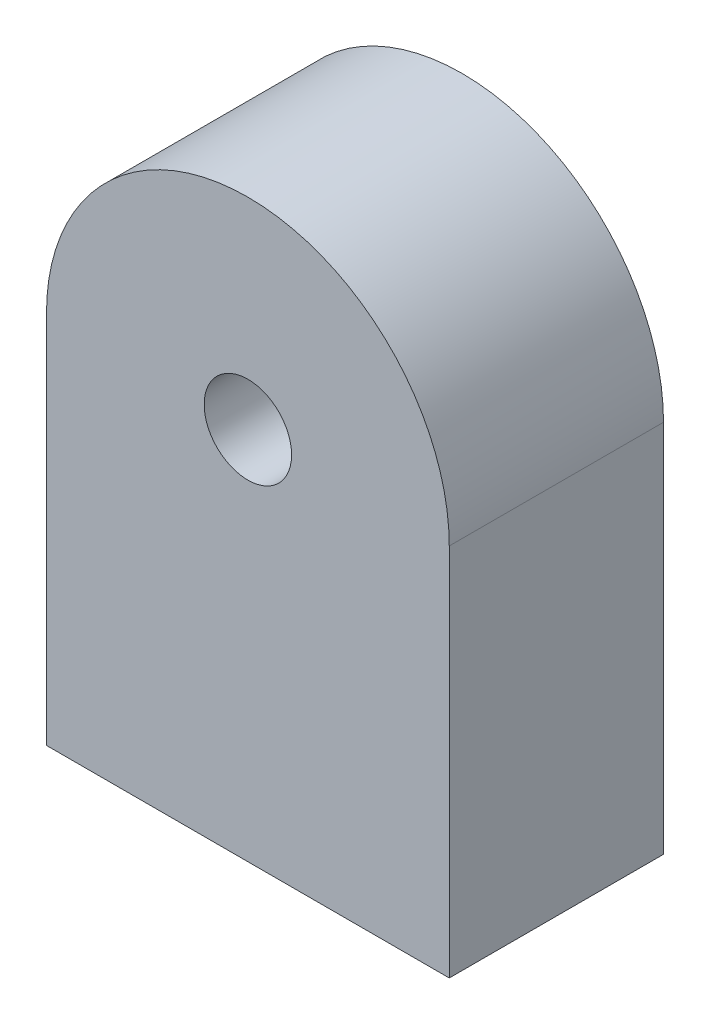
ISO-10303-21;
HEADER;
FILE_DESCRIPTION(('STEP AP214'),'2;1');
FILE_NAME('part.step','',(''),(''),'','','');
FILE_SCHEMA(('AUTOMOTIVE_DESIGN { 1 0 10303 214 1 1 1 1 }'));
ENDSEC;
DATA;
#1=APPLICATION_CONTEXT('core data for automotive mechanical design processes');
#2=APPLICATION_PROTOCOL_DEFINITION('international standard','automotive_design',2000,#1);
#3=PRODUCT_CONTEXT('',#1,'mechanical');
#4=PRODUCT('Part','Part','',(#3));
#5=PRODUCT_RELATED_PRODUCT_CATEGORY('part','',(#4));
#6=PRODUCT_DEFINITION_FORMATION('','',#4);
#7=PRODUCT_DEFINITION_CONTEXT('part definition',#1,'design');
#8=PRODUCT_DEFINITION('design','',#6,#7);
#9=PRODUCT_DEFINITION_SHAPE('','',#8);
#10=(LENGTH_UNIT() NAMED_UNIT(*) SI_UNIT(.MILLI.,.METRE.));
#11=(NAMED_UNIT(*) PLANE_ANGLE_UNIT() SI_UNIT($,.RADIAN.));
#12=(NAMED_UNIT(*) SI_UNIT($,.STERADIAN.) SOLID_ANGLE_UNIT());
#13=UNCERTAINTY_MEASURE_WITH_UNIT(LENGTH_MEASURE(1.E-05),#10,'distance_accuracy_value','');
#14=(GEOMETRIC_REPRESENTATION_CONTEXT(3) GLOBAL_UNCERTAINTY_ASSIGNED_CONTEXT((#13)) GLOBAL_UNIT_ASSIGNED_CONTEXT((#10,
#11,#12)) REPRESENTATION_CONTEXT('',''));
#15=CARTESIAN_POINT('',(0.,0.,0.));
#16=DIRECTION('',(0.,0.,1.));
#17=DIRECTION('',(1.,0.,0.));
#18=AXIS2_PLACEMENT_3D('',#15,#16,#17);
#19=CARTESIAN_POINT('',(-3.68368916814229,4.36615833894154,2.5));
#20=DIRECTION('',(0.,0.,-1.));
#21=DIRECTION('',(-1.,0.,0.));
#22=AXIS2_PLACEMENT_3D('',#19,#20,#21);
#23=PLANE('',#22);
#24=DIRECTION('',(1.,0.,0.));
#25=VECTOR('',#24,1.);
#26=CARTESIAN_POINT('',(-1.33368916814229,0.,2.5));
#27=LINE('',#26,#25);
#28=CARTESIAN_POINT('',(-6.03368916814229,0.,2.5));
#29=VERTEX_POINT('',#28);
#30=CARTESIAN_POINT('',(-1.33368916814229,0.,2.5));
#31=VERTEX_POINT('',#30);
#32=EDGE_CURVE('E83',#29,#31,#27,.T.);
#33=ORIENTED_EDGE('',*,*,#32,.T.);
#34=DIRECTION('',(0.,1.,0.));
#35=VECTOR('',#34,1.);
#36=CARTESIAN_POINT('',(-1.33368916814229,4.36615833894154,2.5));
#37=LINE('',#36,#35);
#38=CARTESIAN_POINT('',(-1.33368916814229,4.36615833894154,2.5));
#39=VERTEX_POINT('',#38);
#40=EDGE_CURVE('E78',#31,#39,#37,.T.);
#41=ORIENTED_EDGE('',*,*,#40,.T.);
#42=CARTESIAN_POINT('',(-3.68368916814229,4.36615833894154,2.5));
#43=DIRECTION('',(0.,0.,1.));
#44=DIRECTION('',(-1.,0.,0.));
#45=AXIS2_PLACEMENT_3D('',#42,#43,#44);
#46=CIRCLE('',#45,2.35);
#47=CARTESIAN_POINT('',(-6.03368916814229,4.36615833894154,2.5));
#48=VERTEX_POINT('',#47);
#49=EDGE_CURVE('E81',#39,#48,#46,.T.);
#50=ORIENTED_EDGE('',*,*,#49,.T.);
#51=DIRECTION('',(0.,-1.,0.));
#52=VECTOR('',#51,1.);
#53=CARTESIAN_POINT('',(-6.03368916814229,0.,2.5));
#54=LINE('',#53,#52);
#55=EDGE_CURVE('E48',#48,#29,#54,.T.);
#56=ORIENTED_EDGE('',*,*,#55,.T.);
#57=EDGE_LOOP('',(#33,#41,#50,#56));
#58=FACE_BOUND('',#57,.T.);
#59=CARTESIAN_POINT('',(-3.68368916814229,4.36615833894154,2.5));
#60=DIRECTION('',(0.,0.,1.));
#61=DIRECTION('',(1.,0.,0.));
#62=AXIS2_PLACEMENT_3D('',#59,#60,#61);
#63=CIRCLE('',#62,0.51);
#64=CARTESIAN_POINT('',(-3.17368916814229,4.36615833894154,2.5));
#65=VERTEX_POINT('',#64);
#66=EDGE_CURVE('E98',#65,#65,#63,.T.);
#67=ORIENTED_EDGE('',*,*,#66,.F.);
#68=EDGE_LOOP('',(#67));
#69=FACE_BOUND('',#68,.T.);
#70=ADVANCED_FACE('F31',(#58,#69),#23,.F.);
#71=CARTESIAN_POINT('',(-3.68368916814229,4.36615833894154,0.));
#72=DIRECTION('',(0.,0.,-1.));
#73=DIRECTION('',(-1.,0.,0.));
#74=AXIS2_PLACEMENT_3D('',#71,#72,#73);
#75=PLANE('',#74);
#76=DIRECTION('',(1.,0.,0.));
#77=VECTOR('',#76,1.);
#78=CARTESIAN_POINT('',(-1.33368916814229,0.,0.));
#79=LINE('',#78,#77);
#80=CARTESIAN_POINT('',(-6.03368916814229,0.,0.));
#81=VERTEX_POINT('',#80);
#82=CARTESIAN_POINT('',(-1.33368916814229,0.,0.));
#83=VERTEX_POINT('',#82);
#84=EDGE_CURVE('E95',#81,#83,#79,.T.);
#85=ORIENTED_EDGE('',*,*,#84,.F.);
#86=DIRECTION('',(0.,-1.,0.));
#87=VECTOR('',#86,1.);
#88=CARTESIAN_POINT('',(-6.03368916814229,0.,0.));
#89=LINE('',#88,#87);
#90=CARTESIAN_POINT('',(-6.03368916814229,4.36615833894154,0.));
#91=VERTEX_POINT('',#90);
#92=EDGE_CURVE('E71',#91,#81,#89,.T.);
#93=ORIENTED_EDGE('',*,*,#92,.F.);
#94=CARTESIAN_POINT('',(-3.68368916814229,4.36615833894154,0.));
#95=DIRECTION('',(0.,0.,1.));
#96=DIRECTION('',(-1.,0.,0.));
#97=AXIS2_PLACEMENT_3D('',#94,#95,#96);
#98=CIRCLE('',#97,2.35);
#99=CARTESIAN_POINT('',(-1.33368916814229,4.36615833894154,0.));
#100=VERTEX_POINT('',#99);
#101=EDGE_CURVE('E65',#100,#91,#98,.T.);
#102=ORIENTED_EDGE('',*,*,#101,.F.);
#103=DIRECTION('',(0.,1.,0.));
#104=VECTOR('',#103,1.);
#105=CARTESIAN_POINT('',(-1.33368916814229,4.36615833894154,0.));
#106=LINE('',#105,#104);
#107=EDGE_CURVE('E87',#83,#100,#106,.T.);
#108=ORIENTED_EDGE('',*,*,#107,.F.);
#109=EDGE_LOOP('',(#85,#93,#102,#108));
#110=FACE_BOUND('',#109,.T.);
#111=CARTESIAN_POINT('',(-3.68368916814229,4.36615833894154,0.));
#112=DIRECTION('',(0.,0.,1.));
#113=DIRECTION('',(1.,0.,0.));
#114=AXIS2_PLACEMENT_3D('',#111,#112,#113);
#115=CIRCLE('',#114,0.51);
#116=CARTESIAN_POINT('',(-3.17368916814229,4.36615833894154,0.));
#117=VERTEX_POINT('',#116);
#118=EDGE_CURVE('E110',#117,#117,#115,.T.);
#119=ORIENTED_EDGE('',*,*,#118,.T.);
#120=EDGE_LOOP('',(#119));
#121=FACE_BOUND('',#120,.T.);
#122=ADVANCED_FACE('F106',(#110,#121),#75,.T.);
#123=CARTESIAN_POINT('',(-1.33368916814229,0.,2.5));
#124=DIRECTION('',(0.,1.,0.));
#125=DIRECTION('',(-1.,0.,0.));
#126=AXIS2_PLACEMENT_3D('',#123,#124,#125);
#127=PLANE('',#126);
#128=ORIENTED_EDGE('',*,*,#84,.T.);
#129=DIRECTION('',(0.,0.,-1.));
#130=VECTOR('',#129,1.);
#131=CARTESIAN_POINT('',(-1.33368916814229,0.,2.5));
#132=LINE('',#131,#130);
#133=EDGE_CURVE('E11',#31,#83,#132,.T.);
#134=ORIENTED_EDGE('',*,*,#133,.F.);
#135=ORIENTED_EDGE('',*,*,#32,.F.);
#136=DIRECTION('',(0.,0.,-1.));
#137=VECTOR('',#136,1.);
#138=CARTESIAN_POINT('',(-6.03368916814229,0.,2.5));
#139=LINE('',#138,#137);
#140=EDGE_CURVE('E91',#29,#81,#139,.T.);
#141=ORIENTED_EDGE('',*,*,#140,.T.);
#142=EDGE_LOOP('',(#128,#134,#135,#141));
#143=FACE_BOUND('',#142,.T.);
#144=ADVANCED_FACE('F33',(#143),#127,.F.);
#145=CARTESIAN_POINT('',(-1.33368916814229,4.36615833894154,2.5));
#146=DIRECTION('',(-1.,0.,0.));
#147=DIRECTION('',(0.,-1.,0.));
#148=AXIS2_PLACEMENT_3D('',#145,#146,#147);
#149=PLANE('',#148);
#150=ORIENTED_EDGE('',*,*,#107,.T.);
#151=DIRECTION('',(0.,0.,-1.));
#152=VECTOR('',#151,1.);
#153=CARTESIAN_POINT('',(-1.33368916814229,4.36615833894154,2.5));
#154=LINE('',#153,#152);
#155=EDGE_CURVE('E40',#39,#100,#154,.T.);
#156=ORIENTED_EDGE('',*,*,#155,.F.);
#157=ORIENTED_EDGE('',*,*,#40,.F.);
#158=ORIENTED_EDGE('',*,*,#133,.T.);
#159=EDGE_LOOP('',(#150,#156,#157,#158));
#160=FACE_BOUND('',#159,.T.);
#161=ADVANCED_FACE('F86',(#160),#149,.F.);
#162=CARTESIAN_POINT('',(-3.68368916814229,4.36615833894154,2.5));
#163=DIRECTION('',(0.,0.,-1.));
#164=DIRECTION('',(-1.,0.,0.));
#165=AXIS2_PLACEMENT_3D('',#162,#163,#164);
#166=CYLINDRICAL_SURFACE('',#165,2.35);
#167=ORIENTED_EDGE('',*,*,#101,.T.);
#168=DIRECTION('',(0.,0.,-1.));
#169=VECTOR('',#168,1.);
#170=CARTESIAN_POINT('',(-6.03368916814229,4.36615833894154,2.5));
#171=LINE('',#170,#169);
#172=EDGE_CURVE('E88',#48,#91,#171,.T.);
#173=ORIENTED_EDGE('',*,*,#172,.F.);
#174=ORIENTED_EDGE('',*,*,#49,.F.);
#175=ORIENTED_EDGE('',*,*,#155,.T.);
#176=EDGE_LOOP('',(#167,#173,#174,#175));
#177=FACE_BOUND('',#176,.T.);
#178=ADVANCED_FACE('F89',(#177),#166,.T.);
#179=CARTESIAN_POINT('',(-6.03368916814229,0.,2.5));
#180=DIRECTION('',(1.,0.,0.));
#181=DIRECTION('',(0.,0.,-1.));
#182=AXIS2_PLACEMENT_3D('',#179,#180,#181);
#183=PLANE('',#182);
#184=ORIENTED_EDGE('',*,*,#92,.T.);
#185=ORIENTED_EDGE('',*,*,#140,.F.);
#186=ORIENTED_EDGE('',*,*,#55,.F.);
#187=ORIENTED_EDGE('',*,*,#172,.T.);
#188=EDGE_LOOP('',(#184,#185,#186,#187));
#189=FACE_BOUND('',#188,.T.);
#190=ADVANCED_FACE('F103',(#189),#183,.F.);
#191=CARTESIAN_POINT('',(-3.68368916814229,4.36615833894154,2.5));
#192=DIRECTION('',(0.,0.,-1.));
#193=DIRECTION('',(-1.,0.,0.));
#194=AXIS2_PLACEMENT_3D('',#191,#192,#193);
#195=CYLINDRICAL_SURFACE('',#194,0.51);
#196=ORIENTED_EDGE('',*,*,#66,.T.);
#197=EDGE_LOOP('',(#196));
#198=FACE_BOUND('',#197,.T.);
#199=ORIENTED_EDGE('',*,*,#118,.F.);
#200=EDGE_LOOP('',(#199));
#201=FACE_BOUND('',#200,.T.);
#202=ADVANCED_FACE('F116',(#198,#201),#195,.F.);
#203=CLOSED_SHELL('',(#70,#122,#144,#161,#178,#190,#202));
#204=MANIFOLD_SOLID_BREP('B2',#203);
#205=ADVANCED_BREP_SHAPE_REPRESENTATION('',(#18,#204),#14);
#206=SHAPE_DEFINITION_REPRESENTATION(#9,#205);
ENDSEC;
END-ISO-10303-21;
